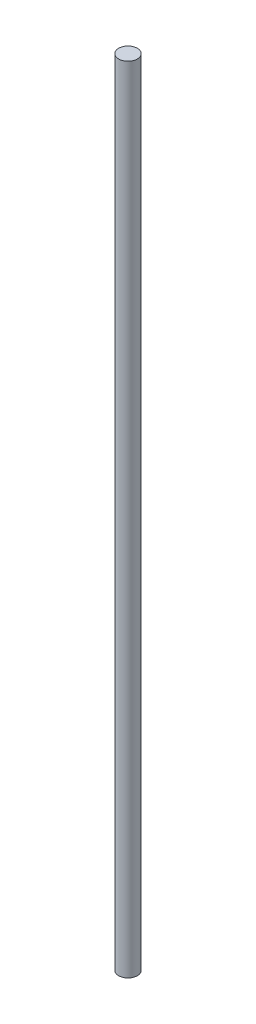
ISO-10303-21;
HEADER;
FILE_DESCRIPTION(('STEP AP214'),'2;1');
FILE_NAME('part.step','',(''),(''),'','','');
FILE_SCHEMA(('AUTOMOTIVE_DESIGN { 1 0 10303 214 1 1 1 1 }'));
ENDSEC;
DATA;
#1=APPLICATION_CONTEXT('core data for automotive mechanical design processes');
#2=APPLICATION_PROTOCOL_DEFINITION('international standard','automotive_design',2000,#1);
#3=PRODUCT_CONTEXT('',#1,'mechanical');
#4=PRODUCT('Part','Part','',(#3));
#5=PRODUCT_RELATED_PRODUCT_CATEGORY('part','',(#4));
#6=PRODUCT_DEFINITION_FORMATION('','',#4);
#7=PRODUCT_DEFINITION_CONTEXT('part definition',#1,'design');
#8=PRODUCT_DEFINITION('design','',#6,#7);
#9=PRODUCT_DEFINITION_SHAPE('','',#8);
#10=(LENGTH_UNIT() NAMED_UNIT(*) SI_UNIT(.MILLI.,.METRE.));
#11=(NAMED_UNIT(*) PLANE_ANGLE_UNIT() SI_UNIT($,.RADIAN.));
#12=(NAMED_UNIT(*) SI_UNIT($,.STERADIAN.) SOLID_ANGLE_UNIT());
#13=UNCERTAINTY_MEASURE_WITH_UNIT(LENGTH_MEASURE(1.E-05),#10,'distance_accuracy_value','');
#14=(GEOMETRIC_REPRESENTATION_CONTEXT(3) GLOBAL_UNCERTAINTY_ASSIGNED_CONTEXT((#13)) GLOBAL_UNIT_ASSIGNED_CONTEXT((#10,
#11,#12)) REPRESENTATION_CONTEXT('',''));
#15=CARTESIAN_POINT('',(0.,0.,0.));
#16=DIRECTION('',(0.,0.,1.));
#17=DIRECTION('',(1.,0.,0.));
#18=AXIS2_PLACEMENT_3D('',#15,#16,#17);
#19=CARTESIAN_POINT('',(0.,50.8,0.));
#20=DIRECTION('',(0.,-1.,0.));
#21=DIRECTION('',(0.,0.,-1.));
#22=AXIS2_PLACEMENT_3D('',#19,#20,#21);
#23=CYLINDRICAL_SURFACE('',#22,0.5969);
#24=CARTESIAN_POINT('',(0.,50.8,0.));
#25=DIRECTION('',(0.,1.,0.));
#26=DIRECTION('',(0.,0.,1.));
#27=AXIS2_PLACEMENT_3D('',#24,#25,#26);
#28=CIRCLE('',#27,0.5969);
#29=CARTESIAN_POINT('',(0.,50.8,0.5969));
#30=VERTEX_POINT('',#29);
#31=EDGE_CURVE('E10',#30,#30,#28,.T.);
#32=ORIENTED_EDGE('',*,*,#31,.F.);
#33=EDGE_LOOP('',(#32));
#34=FACE_BOUND('',#33,.T.);
#35=CARTESIAN_POINT('',(0.,0.,0.));
#36=DIRECTION('',(0.,1.,0.));
#37=DIRECTION('',(0.,0.,1.));
#38=AXIS2_PLACEMENT_3D('',#35,#36,#37);
#39=CIRCLE('',#38,0.5969);
#40=CARTESIAN_POINT('',(0.,0.,0.5969));
#41=VERTEX_POINT('',#40);
#42=EDGE_CURVE('E42',#41,#41,#39,.T.);
#43=ORIENTED_EDGE('',*,*,#42,.T.);
#44=EDGE_LOOP('',(#43));
#45=FACE_BOUND('',#44,.T.);
#46=ADVANCED_FACE('F39',(#34,#45),#23,.T.);
#47=CARTESIAN_POINT('',(0.,50.8,0.));
#48=DIRECTION('',(0.,1.,0.));
#49=DIRECTION('',(0.,0.,1.));
#50=AXIS2_PLACEMENT_3D('',#47,#48,#49);
#51=PLANE('',#50);
#52=ORIENTED_EDGE('',*,*,#31,.T.);
#53=EDGE_LOOP('',(#52));
#54=FACE_BOUND('',#53,.T.);
#55=ADVANCED_FACE('F54',(#54),#51,.T.);
#56=CARTESIAN_POINT('',(0.,0.,0.));
#57=DIRECTION('',(0.,1.,0.));
#58=DIRECTION('',(0.,0.,1.));
#59=AXIS2_PLACEMENT_3D('',#56,#57,#58);
#60=PLANE('',#59);
#61=ORIENTED_EDGE('',*,*,#42,.F.);
#62=EDGE_LOOP('',(#61));
#63=FACE_BOUND('',#62,.T.);
#64=ADVANCED_FACE('F52',(#63),#60,.F.);
#65=CLOSED_SHELL('',(#46,#55,#64));
#66=MANIFOLD_SOLID_BREP('B2',#65);
#67=ADVANCED_BREP_SHAPE_REPRESENTATION('',(#18,#66),#14);
#68=SHAPE_DEFINITION_REPRESENTATION(#9,#67);
ENDSEC;
END-ISO-10303-21;
